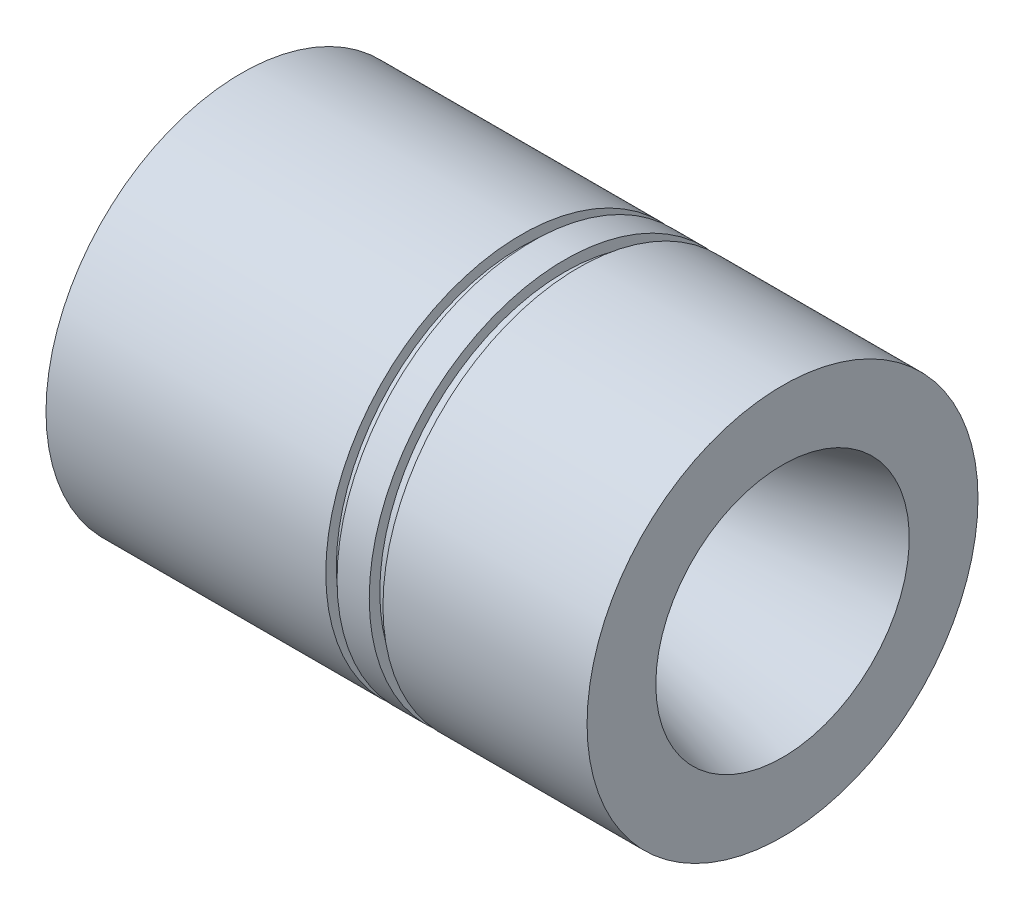
ISO-10303-21;
HEADER;
FILE_DESCRIPTION(('STEP AP214'),'2;1');
FILE_NAME('part.step','',(''),(''),'','','');
FILE_SCHEMA(('AUTOMOTIVE_DESIGN { 1 0 10303 214 1 1 1 1 }'));
ENDSEC;
DATA;
#1=APPLICATION_CONTEXT('core data for automotive mechanical design processes');
#2=APPLICATION_PROTOCOL_DEFINITION('international standard','automotive_design',2000,#1);
#3=PRODUCT_CONTEXT('',#1,'mechanical');
#4=PRODUCT('Part','Part','',(#3));
#5=PRODUCT_RELATED_PRODUCT_CATEGORY('part','',(#4));
#6=PRODUCT_DEFINITION_FORMATION('','',#4);
#7=PRODUCT_DEFINITION_CONTEXT('part definition',#1,'design');
#8=PRODUCT_DEFINITION('design','',#6,#7);
#9=PRODUCT_DEFINITION_SHAPE('','',#8);
#10=(LENGTH_UNIT() NAMED_UNIT(*) SI_UNIT(.MILLI.,.METRE.));
#11=(NAMED_UNIT(*) PLANE_ANGLE_UNIT() SI_UNIT($,.RADIAN.));
#12=(NAMED_UNIT(*) SI_UNIT($,.STERADIAN.) SOLID_ANGLE_UNIT());
#13=UNCERTAINTY_MEASURE_WITH_UNIT(LENGTH_MEASURE(1.E-05),#10,'distance_accuracy_value','');
#14=(GEOMETRIC_REPRESENTATION_CONTEXT(3) GLOBAL_UNCERTAINTY_ASSIGNED_CONTEXT((#13)) GLOBAL_UNIT_ASSIGNED_CONTEXT((#10,
#11,#12)) REPRESENTATION_CONTEXT('',''));
#15=CARTESIAN_POINT('',(0.,0.,0.));
#16=DIRECTION('',(0.,0.,1.));
#17=DIRECTION('',(1.,0.,0.));
#18=AXIS2_PLACEMENT_3D('',#15,#16,#17);
#19=CARTESIAN_POINT('',(0.495005761747276,0.,0.));
#20=DIRECTION('',(-1.,0.,0.));
#21=DIRECTION('',(0.,0.,1.));
#22=AXIS2_PLACEMENT_3D('',#19,#20,#21);
#23=DEGENERATE_TOROIDAL_SURFACE('',#22,44.4485729351636,85.852,.F.);
#24=CARTESIAN_POINT('',(43.4210057617474,0.,0.));
#25=DIRECTION('',(-1.,0.,0.));
#26=DIRECTION('',(0.,0.,1.));
#27=AXIS2_PLACEMENT_3D('',#24,#25,#26);
#28=CIRCLE('',#27,29.901440030538);
#29=CARTESIAN_POINT('',(43.4210057617474,0.,29.901440030538));
#30=VERTEX_POINT('',#29);
#31=EDGE_CURVE('E94',#30,#30,#28,.T.);
#32=ORIENTED_EDGE('',*,*,#31,.F.);
#33=EDGE_LOOP('',(#32));
#34=FACE_BOUND('',#33,.T.);
#35=CARTESIAN_POINT('',(0.,0.,0.));
#36=DIRECTION('',(-1.,0.,0.));
#37=DIRECTION('',(0.,0.,1.));
#38=AXIS2_PLACEMENT_3D('',#35,#36,#37);
#39=CIRCLE('',#38,41.402);
#40=CARTESIAN_POINT('',(0.,0.,41.402));
#41=VERTEX_POINT('',#40);
#42=EDGE_CURVE('E11',#41,#41,#39,.T.);
#43=ORIENTED_EDGE('',*,*,#42,.T.);
#44=EDGE_LOOP('',(#43));
#45=FACE_BOUND('',#44,.T.);
#46=ADVANCED_FACE('F39',(#34,#45),#23,.T.);
#47=CARTESIAN_POINT('',(0.,41.402,0.));
#48=DIRECTION('',(1.,0.,0.));
#49=DIRECTION('',(0.,0.,-1.));
#50=AXIS2_PLACEMENT_3D('',#47,#48,#49);
#51=PLANE('',#50);
#52=ORIENTED_EDGE('',*,*,#42,.F.);
#53=EDGE_LOOP('',(#52));
#54=FACE_BOUND('',#53,.T.);
#55=CARTESIAN_POINT('',(0.,0.,0.));
#56=DIRECTION('',(-1.,0.,0.));
#57=DIRECTION('',(0.,0.,1.));
#58=AXIS2_PLACEMENT_3D('',#55,#56,#57);
#59=CIRCLE('',#58,50.927);
#60=CARTESIAN_POINT('',(0.,0.,50.927));
#61=VERTEX_POINT('',#60);
#62=EDGE_CURVE('E46',#61,#61,#59,.T.);
#63=ORIENTED_EDGE('',*,*,#62,.T.);
#64=EDGE_LOOP('',(#63));
#65=FACE_BOUND('',#64,.T.);
#66=ADVANCED_FACE('F101',(#54,#65),#51,.F.);
#67=CARTESIAN_POINT('',(0.,0.,0.));
#68=DIRECTION('',(-1.,0.,0.));
#69=DIRECTION('',(0.,0.,1.));
#70=AXIS2_PLACEMENT_3D('',#67,#68,#69);
#71=CYLINDRICAL_SURFACE('',#70,50.927);
#72=ORIENTED_EDGE('',*,*,#62,.F.);
#73=EDGE_LOOP('',(#72));
#74=FACE_BOUND('',#73,.T.);
#75=CARTESIAN_POINT('',(72.8929383234951,0.,0.));
#76=DIRECTION('',(-1.,0.,0.));
#77=DIRECTION('',(0.,0.,1.));
#78=AXIS2_PLACEMENT_3D('',#75,#76,#77);
#79=CIRCLE('',#78,50.927);
#80=CARTESIAN_POINT('',(72.8929383234951,0.,50.927));
#81=VERTEX_POINT('',#80);
#82=EDGE_CURVE('E51',#81,#81,#79,.T.);
#83=ORIENTED_EDGE('',*,*,#82,.T.);
#84=EDGE_LOOP('',(#83));
#85=FACE_BOUND('',#84,.T.);
#86=ADVANCED_FACE('F105',(#74,#85),#71,.T.);
#87=CARTESIAN_POINT('',(72.8929383234951,50.927,0.));
#88=DIRECTION('',(-1.,0.,0.));
#89=DIRECTION('',(0.,0.,1.));
#90=AXIS2_PLACEMENT_3D('',#87,#88,#89);
#91=PLANE('',#90);
#92=ORIENTED_EDGE('',*,*,#82,.F.);
#93=EDGE_LOOP('',(#92));
#94=FACE_BOUND('',#93,.T.);
#95=CARTESIAN_POINT('',(72.8929383234951,0.,0.));
#96=DIRECTION('',(-1.,0.,0.));
#97=DIRECTION('',(0.,0.,1.));
#98=AXIS2_PLACEMENT_3D('',#95,#96,#97);
#99=CIRCLE('',#98,48.1802333686761);
#100=CARTESIAN_POINT('',(72.8929383234951,0.,48.1802333686761));
#101=VERTEX_POINT('',#100);
#102=EDGE_CURVE('E56',#101,#101,#99,.T.);
#103=ORIENTED_EDGE('',*,*,#102,.T.);
#104=EDGE_LOOP('',(#103));
#105=FACE_BOUND('',#104,.T.);
#106=ADVANCED_FACE('F110',(#94,#105),#91,.F.);
#107=CARTESIAN_POINT('',(0.,0.,0.));
#108=DIRECTION('',(-1.,0.,0.));
#109=DIRECTION('',(0.,0.,1.));
#110=AXIS2_PLACEMENT_3D('',#107,#108,#109);
#111=CYLINDRICAL_SURFACE('',#110,48.1802333686761);
#112=ORIENTED_EDGE('',*,*,#102,.F.);
#113=EDGE_LOOP('',(#112));
#114=FACE_BOUND('',#113,.T.);
#115=CARTESIAN_POINT('',(75.8243585479709,0.,0.));
#116=DIRECTION('',(-1.,0.,0.));
#117=DIRECTION('',(0.,0.,1.));
#118=AXIS2_PLACEMENT_3D('',#115,#116,#117);
#119=CIRCLE('',#118,48.1802333686761);
#120=CARTESIAN_POINT('',(75.8243585479709,0.,48.1802333686761));
#121=VERTEX_POINT('',#120);
#122=EDGE_CURVE('E61',#121,#121,#119,.T.);
#123=ORIENTED_EDGE('',*,*,#122,.T.);
#124=EDGE_LOOP('',(#123));
#125=FACE_BOUND('',#124,.T.);
#126=ADVANCED_FACE('F116',(#114,#125),#111,.T.);
#127=CARTESIAN_POINT('',(75.8243585479709,48.1802333686761,0.));
#128=DIRECTION('',(1.,0.,0.));
#129=DIRECTION('',(0.,0.,-1.));
#130=AXIS2_PLACEMENT_3D('',#127,#128,#129);
#131=PLANE('',#130);
#132=ORIENTED_EDGE('',*,*,#122,.F.);
#133=EDGE_LOOP('',(#132));
#134=FACE_BOUND('',#133,.T.);
#135=CARTESIAN_POINT('',(75.8243585479709,0.,0.));
#136=DIRECTION('',(-1.,0.,0.));
#137=DIRECTION('',(0.,0.,1.));
#138=AXIS2_PLACEMENT_3D('',#135,#136,#137);
#139=CIRCLE('',#138,50.927);
#140=CARTESIAN_POINT('',(75.8243585479709,0.,50.927));
#141=VERTEX_POINT('',#140);
#142=EDGE_CURVE('E64',#141,#141,#139,.T.);
#143=ORIENTED_EDGE('',*,*,#142,.T.);
#144=EDGE_LOOP('',(#143));
#145=FACE_BOUND('',#144,.T.);
#146=ADVANCED_FACE('F120',(#134,#145),#131,.F.);
#147=CARTESIAN_POINT('',(0.,0.,0.));
#148=DIRECTION('',(-1.,0.,0.));
#149=DIRECTION('',(0.,0.,1.));
#150=AXIS2_PLACEMENT_3D('',#147,#148,#149);
#151=CYLINDRICAL_SURFACE('',#150,50.927);
#152=ORIENTED_EDGE('',*,*,#142,.F.);
#153=EDGE_LOOP('',(#152));
#154=FACE_BOUND('',#153,.T.);
#155=CARTESIAN_POINT('',(84.2184922970007,0.,0.));
#156=DIRECTION('',(-1.,0.,0.));
#157=DIRECTION('',(0.,0.,1.));
#158=AXIS2_PLACEMENT_3D('',#155,#156,#157);
#159=CIRCLE('',#158,50.927);
#160=CARTESIAN_POINT('',(84.2184922970007,0.,50.927));
#161=VERTEX_POINT('',#160);
#162=EDGE_CURVE('E67',#161,#161,#159,.T.);
#163=ORIENTED_EDGE('',*,*,#162,.T.);
#164=EDGE_LOOP('',(#163));
#165=FACE_BOUND('',#164,.T.);
#166=ADVANCED_FACE('F124',(#154,#165),#151,.T.);
#167=CARTESIAN_POINT('',(84.2184922970007,50.927,0.));
#168=DIRECTION('',(-1.,0.,0.));
#169=DIRECTION('',(0.,0.,1.));
#170=AXIS2_PLACEMENT_3D('',#167,#168,#169);
#171=PLANE('',#170);
#172=ORIENTED_EDGE('',*,*,#162,.F.);
#173=EDGE_LOOP('',(#172));
#174=FACE_BOUND('',#173,.T.);
#175=CARTESIAN_POINT('',(84.2184922970007,0.,0.));
#176=DIRECTION('',(-1.,0.,0.));
#177=DIRECTION('',(0.,0.,1.));
#178=AXIS2_PLACEMENT_3D('',#175,#176,#177);
#179=CIRCLE('',#178,48.1802333686761);
#180=CARTESIAN_POINT('',(84.2184922970007,0.,48.1802333686761));
#181=VERTEX_POINT('',#180);
#182=EDGE_CURVE('E70',#181,#181,#179,.T.);
#183=ORIENTED_EDGE('',*,*,#182,.T.);
#184=EDGE_LOOP('',(#183));
#185=FACE_BOUND('',#184,.T.);
#186=ADVANCED_FACE('F128',(#174,#185),#171,.F.);
#187=CARTESIAN_POINT('',(0.,0.,0.));
#188=DIRECTION('',(-1.,0.,0.));
#189=DIRECTION('',(0.,0.,1.));
#190=AXIS2_PLACEMENT_3D('',#187,#188,#189);
#191=CYLINDRICAL_SURFACE('',#190,48.1802333686761);
#192=ORIENTED_EDGE('',*,*,#182,.F.);
#193=EDGE_LOOP('',(#192));
#194=FACE_BOUND('',#193,.T.);
#195=CARTESIAN_POINT('',(87.7885038756057,0.,0.));
#196=DIRECTION('',(-1.,0.,0.));
#197=DIRECTION('',(0.,0.,1.));
#198=AXIS2_PLACEMENT_3D('',#195,#196,#197);
#199=CIRCLE('',#198,48.1802333686761);
#200=CARTESIAN_POINT('',(87.7885038756057,0.,48.1802333686761));
#201=VERTEX_POINT('',#200);
#202=EDGE_CURVE('E73',#201,#201,#199,.T.);
#203=ORIENTED_EDGE('',*,*,#202,.T.);
#204=EDGE_LOOP('',(#203));
#205=FACE_BOUND('',#204,.T.);
#206=ADVANCED_FACE('F132',(#194,#205),#191,.T.);
#207=CARTESIAN_POINT('',(87.7885038756057,48.1802333686761,0.));
#208=DIRECTION('',(1.,0.,0.));
#209=DIRECTION('',(0.,0.,-1.));
#210=AXIS2_PLACEMENT_3D('',#207,#208,#209);
#211=PLANE('',#210);
#212=ORIENTED_EDGE('',*,*,#202,.F.);
#213=EDGE_LOOP('',(#212));
#214=FACE_BOUND('',#213,.T.);
#215=CARTESIAN_POINT('',(87.7885038756057,0.,0.));
#216=DIRECTION('',(-1.,0.,0.));
#217=DIRECTION('',(0.,0.,1.));
#218=AXIS2_PLACEMENT_3D('',#215,#216,#217);
#219=CIRCLE('',#218,50.927);
#220=CARTESIAN_POINT('',(87.7885038756057,0.,50.927));
#221=VERTEX_POINT('',#220);
#222=EDGE_CURVE('E76',#221,#221,#219,.T.);
#223=ORIENTED_EDGE('',*,*,#222,.T.);
#224=EDGE_LOOP('',(#223));
#225=FACE_BOUND('',#224,.T.);
#226=ADVANCED_FACE('F136',(#214,#225),#211,.F.);
#227=CARTESIAN_POINT('',(0.,0.,0.));
#228=DIRECTION('',(-1.,0.,0.));
#229=DIRECTION('',(0.,0.,1.));
#230=AXIS2_PLACEMENT_3D('',#227,#228,#229);
#231=CYLINDRICAL_SURFACE('',#230,50.927);
#232=ORIENTED_EDGE('',*,*,#222,.F.);
#233=EDGE_LOOP('',(#232));
#234=FACE_BOUND('',#233,.T.);
#235=CARTESIAN_POINT('',(140.97,0.,0.));
#236=DIRECTION('',(-1.,0.,0.));
#237=DIRECTION('',(0.,0.,1.));
#238=AXIS2_PLACEMENT_3D('',#235,#236,#237);
#239=CIRCLE('',#238,50.927);
#240=CARTESIAN_POINT('',(140.97,0.,50.927));
#241=VERTEX_POINT('',#240);
#242=EDGE_CURVE('E79',#241,#241,#239,.T.);
#243=ORIENTED_EDGE('',*,*,#242,.T.);
#244=EDGE_LOOP('',(#243));
#245=FACE_BOUND('',#244,.T.);
#246=ADVANCED_FACE('F140',(#234,#245),#231,.T.);
#247=CARTESIAN_POINT('',(140.97,50.927,0.));
#248=DIRECTION('',(-1.,0.,0.));
#249=DIRECTION('',(0.,0.,1.));
#250=AXIS2_PLACEMENT_3D('',#247,#248,#249);
#251=PLANE('',#250);
#252=ORIENTED_EDGE('',*,*,#242,.F.);
#253=EDGE_LOOP('',(#252));
#254=FACE_BOUND('',#253,.T.);
#255=CARTESIAN_POINT('',(140.97,0.,0.));
#256=DIRECTION('',(-1.,0.,0.));
#257=DIRECTION('',(0.,0.,1.));
#258=AXIS2_PLACEMENT_3D('',#255,#256,#257);
#259=CIRCLE('',#258,33.02);
#260=CARTESIAN_POINT('',(140.97,0.,33.02));
#261=VERTEX_POINT('',#260);
#262=EDGE_CURVE('E82',#261,#261,#259,.T.);
#263=ORIENTED_EDGE('',*,*,#262,.T.);
#264=EDGE_LOOP('',(#263));
#265=FACE_BOUND('',#264,.T.);
#266=ADVANCED_FACE('F144',(#254,#265),#251,.F.);
#267=CARTESIAN_POINT('',(75.8243585479709,0.,0.));
#268=DIRECTION('',(1.,0.,0.));
#269=DIRECTION('',(0.,0.,-1.));
#270=AXIS2_PLACEMENT_3D('',#267,#268,#269);
#271=CONICAL_SURFACE('',#270,15.5642779825213,0.26179938779915);
#272=ORIENTED_EDGE('',*,*,#262,.F.);
#273=EDGE_LOOP('',(#272));
#274=FACE_BOUND('',#273,.T.);
#275=CARTESIAN_POINT('',(75.8243585479709,0.,0.));
#276=DIRECTION('',(-1.,0.,0.));
#277=DIRECTION('',(0.,0.,1.));
#278=AXIS2_PLACEMENT_3D('',#275,#276,#277);
#279=CIRCLE('',#278,15.5642779825213);
#280=CARTESIAN_POINT('',(75.8243585479709,0.,15.5642779825213));
#281=VERTEX_POINT('',#280);
#282=EDGE_CURVE('E85',#281,#281,#279,.T.);
#283=ORIENTED_EDGE('',*,*,#282,.T.);
#284=EDGE_LOOP('',(#283));
#285=FACE_BOUND('',#284,.T.);
#286=ADVANCED_FACE('F148',(#274,#285),#271,.F.);
#287=CARTESIAN_POINT('',(74.312337686482,0.,0.));
#288=DIRECTION('',(-1.,0.,0.));
#289=DIRECTION('',(0.,0.,1.));
#290=AXIS2_PLACEMENT_3D('',#287,#288,#289);
#291=TOROIDAL_SURFACE('',#290,21.207216659702,5.842);
#292=ORIENTED_EDGE('',*,*,#282,.F.);
#293=EDGE_LOOP('',(#292));
#294=FACE_BOUND('',#293,.T.);
#295=CARTESIAN_POINT('',(74.168,0.,0.));
#296=DIRECTION('',(-1.,0.,0.));
#297=DIRECTION('',(0.,0.,1.));
#298=AXIS2_PLACEMENT_3D('',#295,#296,#297);
#299=CIRCLE('',#298,15.367);
#300=CARTESIAN_POINT('',(74.168,0.,15.367));
#301=VERTEX_POINT('',#300);
#302=EDGE_CURVE('E88',#301,#301,#299,.T.);
#303=ORIENTED_EDGE('',*,*,#302,.T.);
#304=EDGE_LOOP('',(#303));
#305=FACE_BOUND('',#304,.T.);
#306=ADVANCED_FACE('F152',(#294,#305),#291,.T.);
#307=CARTESIAN_POINT('',(74.7327996427556,0.,0.));
#308=DIRECTION('',(-1.,0.,0.));
#309=DIRECTION('',(0.,0.,1.));
#310=AXIS2_PLACEMENT_3D('',#307,#308,#309);
#311=TOROIDAL_SURFACE('',#310,38.2200217118775,22.86);
#312=ORIENTED_EDGE('',*,*,#302,.F.);
#313=EDGE_LOOP('',(#312));
#314=FACE_BOUND('',#313,.T.);
#315=CARTESIAN_POINT('',(63.3027996427556,0.,0.));
#316=DIRECTION('',(-1.,0.,0.));
#317=DIRECTION('',(0.,0.,1.));
#318=AXIS2_PLACEMENT_3D('',#315,#316,#317);
#319=CIRCLE('',#318,18.4226809813652);
#320=CARTESIAN_POINT('',(63.3027996427556,0.,18.4226809813652));
#321=VERTEX_POINT('',#320);
#322=EDGE_CURVE('E91',#321,#321,#319,.T.);
#323=ORIENTED_EDGE('',*,*,#322,.T.);
#324=EDGE_LOOP('',(#323));
#325=FACE_BOUND('',#324,.T.);
#326=ADVANCED_FACE('F156',(#314,#325),#311,.T.);
#327=CARTESIAN_POINT('',(43.4210057617474,0.,0.));
#328=DIRECTION('',(-1.,0.,0.));
#329=DIRECTION('',(0.,0.,1.));
#330=AXIS2_PLACEMENT_3D('',#327,#328,#329);
#331=CONICAL_SURFACE('',#330,29.901440030538,0.5235987755983);
#332=ORIENTED_EDGE('',*,*,#322,.F.);
#333=EDGE_LOOP('',(#332));
#334=FACE_BOUND('',#333,.T.);
#335=ORIENTED_EDGE('',*,*,#31,.T.);
#336=EDGE_LOOP('',(#335));
#337=FACE_BOUND('',#336,.T.);
#338=ADVANCED_FACE('F98',(#334,#337),#331,.F.);
#339=CLOSED_SHELL('',(#46,#66,#86,#106,#126,#146,#166,#186,#206,#226,#246,#266,#286,#306,#326,#338));
#340=MANIFOLD_SOLID_BREP('B2',#339);
#341=ADVANCED_BREP_SHAPE_REPRESENTATION('',(#18,#340),#14);
#342=SHAPE_DEFINITION_REPRESENTATION(#9,#341);
ENDSEC;
END-ISO-10303-21;
